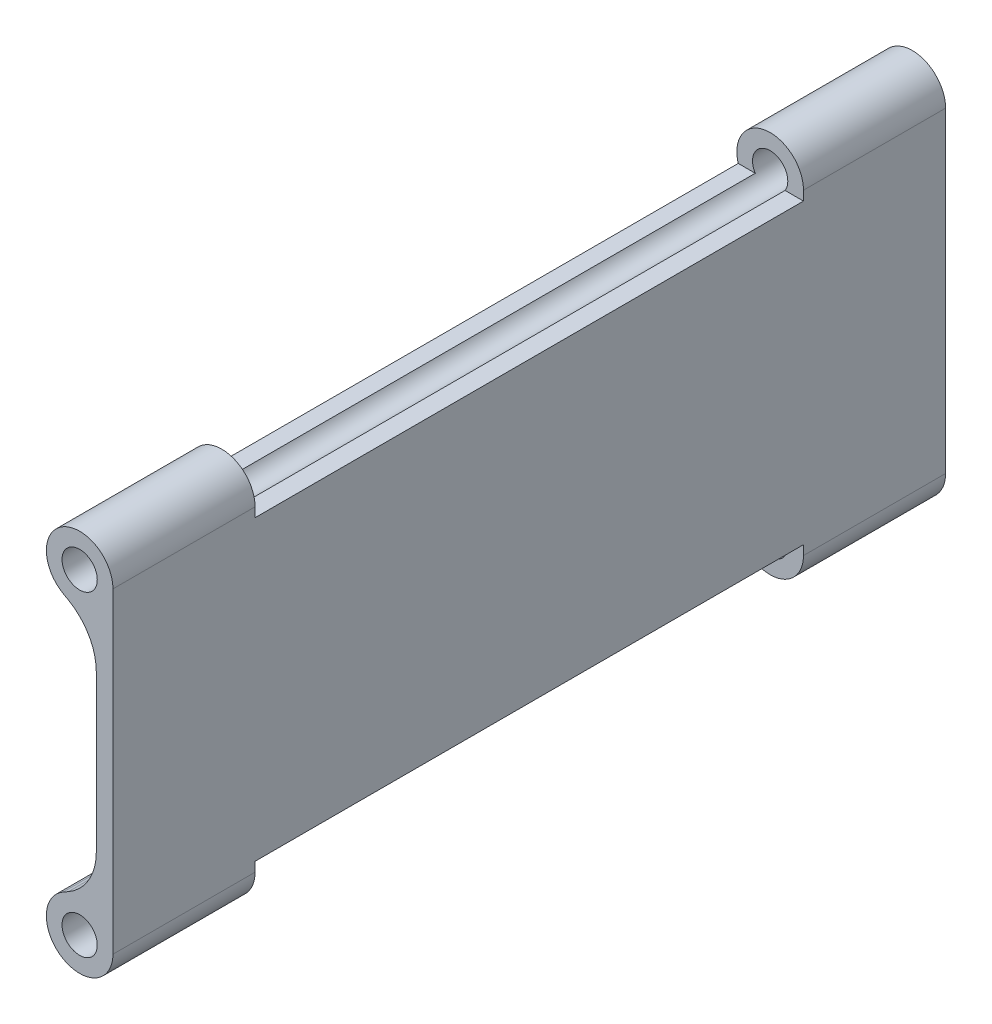
ISO-10303-21;
HEADER;
FILE_DESCRIPTION(('STEP AP214'),'2;1');
FILE_NAME('part.step','',(''),(''),'','','');
FILE_SCHEMA(('AUTOMOTIVE_DESIGN { 1 0 10303 214 1 1 1 1 }'));
ENDSEC;
DATA;
#1=APPLICATION_CONTEXT('core data for automotive mechanical design processes');
#2=APPLICATION_PROTOCOL_DEFINITION('international standard','automotive_design',2000,#1);
#3=PRODUCT_CONTEXT('',#1,'mechanical');
#4=PRODUCT('Part','Part','',(#3));
#5=PRODUCT_RELATED_PRODUCT_CATEGORY('part','',(#4));
#6=PRODUCT_DEFINITION_FORMATION('','',#4);
#7=PRODUCT_DEFINITION_CONTEXT('part definition',#1,'design');
#8=PRODUCT_DEFINITION('design','',#6,#7);
#9=PRODUCT_DEFINITION_SHAPE('','',#8);
#10=(LENGTH_UNIT() NAMED_UNIT(*) SI_UNIT(.MILLI.,.METRE.));
#11=(NAMED_UNIT(*) PLANE_ANGLE_UNIT() SI_UNIT($,.RADIAN.));
#12=(NAMED_UNIT(*) SI_UNIT($,.STERADIAN.) SOLID_ANGLE_UNIT());
#13=UNCERTAINTY_MEASURE_WITH_UNIT(LENGTH_MEASURE(1.E-05),#10,'distance_accuracy_value','');
#14=(GEOMETRIC_REPRESENTATION_CONTEXT(3) GLOBAL_UNCERTAINTY_ASSIGNED_CONTEXT((#13)) GLOBAL_UNIT_ASSIGNED_CONTEXT((#10,
#11,#12)) REPRESENTATION_CONTEXT('',''));
#15=CARTESIAN_POINT('',(0.,0.,0.));
#16=DIRECTION('',(0.,0.,1.));
#17=DIRECTION('',(1.,0.,0.));
#18=AXIS2_PLACEMENT_3D('',#15,#16,#17);
#19=CARTESIAN_POINT('',(-6.,28.5,-150.));
#20=DIRECTION('',(0.,0.,1.));
#21=DIRECTION('',(1.,0.,0.));
#22=AXIS2_PLACEMENT_3D('',#19,#20,#21);
#23=CYLINDRICAL_SURFACE('',#22,6.);
#24=CARTESIAN_POINT('',(-6.,28.5,-25.604093846782));
#25=DIRECTION('',(0.,0.,1.));
#26=DIRECTION('',(0.,-1.,0.));
#27=AXIS2_PLACEMENT_3D('',#24,#25,#26);
#28=CIRCLE('',#27,6.);
#29=CARTESIAN_POINT('',(-11.7548405846867,26.8024105782486,-25.604093846782));
#30=VERTEX_POINT('',#29);
#31=CARTESIAN_POINT('',(0.,28.5,-25.604093846782));
#32=VERTEX_POINT('',#31);
#33=EDGE_CURVE('E213',#30,#32,#28,.F.);
#34=ORIENTED_EDGE('',*,*,#33,.F.);
#35=DIRECTION('',(0.,0.,1.));
#36=VECTOR('',#35,1.);
#37=CARTESIAN_POINT('',(-11.7548405846867,26.8024105782486,-150.));
#38=LINE('',#37,#36);
#39=CARTESIAN_POINT('',(-11.7548405846867,26.8024105782486,-124.395906153218));
#40=VERTEX_POINT('',#39);
#41=EDGE_CURVE('E209',#40,#30,#38,.T.);
#42=ORIENTED_EDGE('',*,*,#41,.F.);
#43=CARTESIAN_POINT('',(-6.,28.5,-124.395906153218));
#44=DIRECTION('',(0.,0.,-1.));
#45=DIRECTION('',(-1.,0.,0.));
#46=AXIS2_PLACEMENT_3D('',#43,#44,#45);
#47=CIRCLE('',#46,6.);
#48=CARTESIAN_POINT('',(0.,28.5,-124.395906153218));
#49=VERTEX_POINT('',#48);
#50=EDGE_CURVE('E211',#49,#40,#47,.F.);
#51=ORIENTED_EDGE('',*,*,#50,.F.);
#52=DIRECTION('',(0.,0.,1.));
#53=VECTOR('',#52,1.);
#54=CARTESIAN_POINT('',(0.,28.5,-150.));
#55=LINE('',#54,#53);
#56=CARTESIAN_POINT('',(0.,28.5,-150.));
#57=VERTEX_POINT('',#56);
#58=EDGE_CURVE('E184',#57,#49,#55,.T.);
#59=ORIENTED_EDGE('',*,*,#58,.F.);
#60=CARTESIAN_POINT('',(-6.,28.5,-150.));
#61=DIRECTION('',(0.,0.,1.));
#62=DIRECTION('',(1.,0.,0.));
#63=AXIS2_PLACEMENT_3D('',#60,#61,#62);
#64=CIRCLE('',#63,6.);
#65=CARTESIAN_POINT('',(-8.98691390995377,23.2963142586697,-150.));
#66=VERTEX_POINT('',#65);
#67=EDGE_CURVE('E228',#57,#66,#64,.T.);
#68=ORIENTED_EDGE('',*,*,#67,.T.);
#69=DIRECTION('',(0.,0.,1.));
#70=VECTOR('',#69,1.);
#71=CARTESIAN_POINT('',(-8.98691390995377,23.2963142586697,-150.));
#72=LINE('',#71,#70);
#73=CARTESIAN_POINT('',(-8.98691390995377,23.2963142586697,0.));
#74=VERTEX_POINT('',#73);
#75=EDGE_CURVE('E245',#66,#74,#72,.T.);
#76=ORIENTED_EDGE('',*,*,#75,.T.);
#77=CARTESIAN_POINT('',(-6.,28.5,0.));
#78=DIRECTION('',(0.,0.,1.));
#79=DIRECTION('',(1.,0.,0.));
#80=AXIS2_PLACEMENT_3D('',#77,#78,#79);
#81=CIRCLE('',#80,6.);
#82=CARTESIAN_POINT('',(0.,28.5,0.));
#83=VERTEX_POINT('',#82);
#84=EDGE_CURVE('E225',#83,#74,#81,.T.);
#85=ORIENTED_EDGE('',*,*,#84,.F.);
#86=EDGE_CURVE('E263',#32,#83,#55,.T.);
#87=ORIENTED_EDGE('',*,*,#86,.F.);
#88=EDGE_LOOP('',(#34,#42,#51,#59,#68,#76,#85,#87));
#89=FACE_BOUND('',#88,.T.);
#90=ADVANCED_FACE('F37',(#89),#23,.T.);
#91=CARTESIAN_POINT('',(0.,28.5,-150.));
#92=DIRECTION('',(1.,0.,0.));
#93=DIRECTION('',(0.,0.,-1.));
#94=AXIS2_PLACEMENT_3D('',#91,#92,#93);
#95=PLANE('',#94);
#96=DIRECTION('',(0.,-1.,0.));
#97=VECTOR('',#96,1.);
#98=CARTESIAN_POINT('',(0.,44.9478454916756,-25.604093846782));
#99=LINE('',#98,#97);
#100=CARTESIAN_POINT('',(0.,26.8024105782486,-25.604093846782));
#101=VERTEX_POINT('',#100);
#102=EDGE_CURVE('E180',#32,#101,#99,.T.);
#103=ORIENTED_EDGE('',*,*,#102,.F.);
#104=ORIENTED_EDGE('',*,*,#86,.T.);
#105=DIRECTION('',(0.,1.,0.));
#106=VECTOR('',#105,1.);
#107=CARTESIAN_POINT('',(0.,28.5,0.));
#108=LINE('',#107,#106);
#109=CARTESIAN_POINT('',(0.,-28.5,0.));
#110=VERTEX_POINT('',#109);
#111=EDGE_CURVE('E232',#110,#83,#108,.T.);
#112=ORIENTED_EDGE('',*,*,#111,.F.);
#113=DIRECTION('',(0.,0.,1.));
#114=VECTOR('',#113,1.);
#115=CARTESIAN_POINT('',(0.,-28.5,-150.));
#116=LINE('',#115,#114);
#117=CARTESIAN_POINT('',(0.,-28.5,-25.604093846782));
#118=VERTEX_POINT('',#117);
#119=EDGE_CURVE('E266',#118,#110,#116,.T.);
#120=ORIENTED_EDGE('',*,*,#119,.F.);
#121=DIRECTION('',(0.,-1.,0.));
#122=VECTOR('',#121,1.);
#123=CARTESIAN_POINT('',(0.,-44.9478454916756,-25.604093846782));
#124=LINE('',#123,#122);
#125=CARTESIAN_POINT('',(0.,-26.8024105782486,-25.604093846782));
#126=VERTEX_POINT('',#125);
#127=EDGE_CURVE('E195',#126,#118,#124,.T.);
#128=ORIENTED_EDGE('',*,*,#127,.F.);
#129=DIRECTION('',(0.,0.,1.));
#130=VECTOR('',#129,1.);
#131=CARTESIAN_POINT('',(0.,-26.8024105782486,-25.604093846782));
#132=LINE('',#131,#130);
#133=CARTESIAN_POINT('',(0.,-26.8024105782486,-124.395906153218));
#134=VERTEX_POINT('',#133);
#135=EDGE_CURVE('E192',#134,#126,#132,.T.);
#136=ORIENTED_EDGE('',*,*,#135,.F.);
#137=DIRECTION('',(0.,1.,0.));
#138=VECTOR('',#137,1.);
#139=CARTESIAN_POINT('',(0.,-44.9478454916756,-124.395906153218));
#140=LINE('',#139,#138);
#141=CARTESIAN_POINT('',(0.,-28.5,-124.395906153218));
#142=VERTEX_POINT('',#141);
#143=EDGE_CURVE('E189',#142,#134,#140,.T.);
#144=ORIENTED_EDGE('',*,*,#143,.F.);
#145=CARTESIAN_POINT('',(0.,-28.5,-150.));
#146=VERTEX_POINT('',#145);
#147=EDGE_CURVE('E264',#146,#142,#116,.T.);
#148=ORIENTED_EDGE('',*,*,#147,.F.);
#149=DIRECTION('',(0.,1.,0.));
#150=VECTOR('',#149,1.);
#151=CARTESIAN_POINT('',(0.,28.5,-150.));
#152=LINE('',#151,#150);
#153=EDGE_CURVE('E243',#146,#57,#152,.T.);
#154=ORIENTED_EDGE('',*,*,#153,.T.);
#155=ORIENTED_EDGE('',*,*,#58,.T.);
#156=DIRECTION('',(0.,1.,0.));
#157=VECTOR('',#156,1.);
#158=CARTESIAN_POINT('',(0.,44.9478454916756,-124.395906153218));
#159=LINE('',#158,#157);
#160=CARTESIAN_POINT('',(0.,26.8024105782486,-124.395906153218));
#161=VERTEX_POINT('',#160);
#162=EDGE_CURVE('E167',#161,#49,#159,.T.);
#163=ORIENTED_EDGE('',*,*,#162,.F.);
#164=DIRECTION('',(0.,0.,-1.));
#165=VECTOR('',#164,1.);
#166=CARTESIAN_POINT('',(0.,26.8024105782486,-25.604093846782));
#167=LINE('',#166,#165);
#168=EDGE_CURVE('E176',#101,#161,#167,.T.);
#169=ORIENTED_EDGE('',*,*,#168,.F.);
#170=EDGE_LOOP('',(#103,#104,#112,#120,#128,#136,#144,#148,#154,#155,#163,#169));
#171=FACE_BOUND('',#170,.T.);
#172=ADVANCED_FACE('F182',(#171),#95,.T.);
#173=CARTESIAN_POINT('',(-6.,-28.5,-150.));
#174=DIRECTION('',(0.,0.,1.));
#175=DIRECTION('',(1.,0.,0.));
#176=AXIS2_PLACEMENT_3D('',#173,#174,#175);
#177=CYLINDRICAL_SURFACE('',#176,6.);
#178=CARTESIAN_POINT('',(-6.,-28.5,-124.395906153218));
#179=DIRECTION('',(0.,0.,-1.));
#180=DIRECTION('',(-1.,0.,0.));
#181=AXIS2_PLACEMENT_3D('',#178,#179,#180);
#182=CIRCLE('',#181,6.);
#183=CARTESIAN_POINT('',(-11.7548405846867,-26.8024105782486,-124.395906153218));
#184=VERTEX_POINT('',#183);
#185=EDGE_CURVE('E60',#184,#142,#182,.F.);
#186=ORIENTED_EDGE('',*,*,#185,.F.);
#187=DIRECTION('',(0.,0.,1.));
#188=VECTOR('',#187,1.);
#189=CARTESIAN_POINT('',(-11.7548405846867,-26.8024105782486,-150.));
#190=LINE('',#189,#188);
#191=CARTESIAN_POINT('',(-11.7548405846867,-26.8024105782486,-25.604093846782));
#192=VERTEX_POINT('',#191);
#193=EDGE_CURVE('E204',#192,#184,#190,.F.);
#194=ORIENTED_EDGE('',*,*,#193,.F.);
#195=CARTESIAN_POINT('',(-6.,-28.5,-25.604093846782));
#196=DIRECTION('',(0.,0.,1.));
#197=DIRECTION('',(1.,0.,0.));
#198=AXIS2_PLACEMENT_3D('',#195,#196,#197);
#199=CIRCLE('',#198,6.);
#200=EDGE_CURVE('E207',#118,#192,#199,.F.);
#201=ORIENTED_EDGE('',*,*,#200,.F.);
#202=ORIENTED_EDGE('',*,*,#119,.T.);
#203=CARTESIAN_POINT('',(-6.,-28.5,0.));
#204=DIRECTION('',(0.,0.,1.));
#205=DIRECTION('',(-1.,0.,0.));
#206=AXIS2_PLACEMENT_3D('',#203,#204,#205);
#207=CIRCLE('',#206,6.);
#208=CARTESIAN_POINT('',(-8.98691390995377,-23.2963142586697,0.));
#209=VERTEX_POINT('',#208);
#210=EDGE_CURVE('E256',#209,#110,#207,.T.);
#211=ORIENTED_EDGE('',*,*,#210,.F.);
#212=DIRECTION('',(0.,0.,1.));
#213=VECTOR('',#212,1.);
#214=CARTESIAN_POINT('',(-8.98691390995377,-23.2963142586697,-150.));
#215=LINE('',#214,#213);
#216=CARTESIAN_POINT('',(-8.98691390995377,-23.2963142586697,-150.));
#217=VERTEX_POINT('',#216);
#218=EDGE_CURVE('E267',#217,#209,#215,.T.);
#219=ORIENTED_EDGE('',*,*,#218,.F.);
#220=CARTESIAN_POINT('',(-6.,-28.5,-150.));
#221=DIRECTION('',(0.,0.,1.));
#222=DIRECTION('',(-1.,0.,0.));
#223=AXIS2_PLACEMENT_3D('',#220,#221,#222);
#224=CIRCLE('',#223,6.);
#225=EDGE_CURVE('E240',#217,#146,#224,.T.);
#226=ORIENTED_EDGE('',*,*,#225,.T.);
#227=ORIENTED_EDGE('',*,*,#147,.T.);
#228=EDGE_LOOP('',(#186,#194,#201,#202,#211,#219,#226,#227));
#229=FACE_BOUND('',#228,.T.);
#230=ADVANCED_FACE('F329',(#229),#177,.T.);
#231=CARTESIAN_POINT('',(-2.99999999999999,-19.8598276366384,-150.));
#232=DIRECTION('',(-0.497818984992297,0.867280956888389,0.));
#233=DIRECTION('',(-0.867280956888389,-0.497818984992297,0.));
#234=AXIS2_PLACEMENT_3D('',#231,#232,#233);
#235=PLANE('',#234);
#236=DIRECTION('',(-0.867280956888389,-0.497818984992297,0.));
#237=VECTOR('',#236,1.);
#238=CARTESIAN_POINT('',(-2.99999999999999,-19.8598276366384,0.));
#239=LINE('',#238,#237);
#240=CARTESIAN_POINT('',(-8.02181015007702,-22.7423450168246,0.));
#241=VERTEX_POINT('',#240);
#242=EDGE_CURVE('E254',#241,#209,#239,.T.);
#243=ORIENTED_EDGE('',*,*,#242,.F.);
#244=DIRECTION('',(0.,0.,1.));
#245=VECTOR('',#244,1.);
#246=CARTESIAN_POINT('',(-8.02181015007702,-22.7423450168246,-150.));
#247=LINE('',#246,#245);
#248=CARTESIAN_POINT('',(-8.02181015007702,-22.7423450168246,-150.));
#249=VERTEX_POINT('',#248);
#250=EDGE_CURVE('E275',#241,#249,#247,.F.);
#251=ORIENTED_EDGE('',*,*,#250,.T.);
#252=DIRECTION('',(-0.867280956888389,-0.497818984992297,0.));
#253=VECTOR('',#252,1.);
#254=CARTESIAN_POINT('',(-2.99999999999999,-19.8598276366384,-150.));
#255=LINE('',#254,#253);
#256=EDGE_CURVE('E238',#249,#217,#255,.T.);
#257=ORIENTED_EDGE('',*,*,#256,.T.);
#258=ORIENTED_EDGE('',*,*,#218,.T.);
#259=EDGE_LOOP('',(#243,#251,#257,#258));
#260=FACE_BOUND('',#259,.T.);
#261=ADVANCED_FACE('F418',(#260),#235,.T.);
#262=CARTESIAN_POINT('',(-2.99999999999999,19.8598276366384,-150.));
#263=DIRECTION('',(-1.,0.,0.));
#264=DIRECTION('',(0.,0.,1.));
#265=AXIS2_PLACEMENT_3D('',#262,#263,#264);
#266=PLANE('',#265);
#267=DIRECTION('',(0.,-1.,0.));
#268=VECTOR('',#267,1.);
#269=CARTESIAN_POINT('',(-2.99999999999999,19.8598276366384,-150.));
#270=LINE('',#269,#268);
#271=CARTESIAN_POINT('',(-2.99999999999999,14.0695354479408,-150.));
#272=VERTEX_POINT('',#271);
#273=CARTESIAN_POINT('',(-2.99999999999999,-14.0695354479408,-150.));
#274=VERTEX_POINT('',#273);
#275=EDGE_CURVE('E235',#272,#274,#270,.T.);
#276=ORIENTED_EDGE('',*,*,#275,.T.);
#277=DIRECTION('',(0.,0.,1.));
#278=VECTOR('',#277,1.);
#279=CARTESIAN_POINT('',(-2.99999999999999,-14.0695354479408,0.));
#280=LINE('',#279,#278);
#281=CARTESIAN_POINT('',(-2.99999999999999,-14.0695354479408,0.));
#282=VERTEX_POINT('',#281);
#283=EDGE_CURVE('E272',#274,#282,#280,.T.);
#284=ORIENTED_EDGE('',*,*,#283,.T.);
#285=DIRECTION('',(0.,-1.,0.));
#286=VECTOR('',#285,1.);
#287=CARTESIAN_POINT('',(-2.99999999999999,19.8598276366384,0.));
#288=LINE('',#287,#286);
#289=CARTESIAN_POINT('',(-2.99999999999999,14.0695354479408,0.));
#290=VERTEX_POINT('',#289);
#291=EDGE_CURVE('E251',#290,#282,#288,.T.);
#292=ORIENTED_EDGE('',*,*,#291,.F.);
#293=DIRECTION('',(0.,0.,1.));
#294=VECTOR('',#293,1.);
#295=CARTESIAN_POINT('',(-2.99999999999999,14.0695354479408,-150.));
#296=LINE('',#295,#294);
#297=EDGE_CURVE('E262',#290,#272,#296,.F.);
#298=ORIENTED_EDGE('',*,*,#297,.T.);
#299=EDGE_LOOP('',(#276,#284,#292,#298));
#300=FACE_BOUND('',#299,.T.);
#301=ADVANCED_FACE('F383',(#300),#266,.T.);
#302=CARTESIAN_POINT('',(-2.99999999999999,19.8598276366384,-150.));
#303=DIRECTION('',(-0.497818984992297,-0.867280956888389,0.));
#304=DIRECTION('',(0.867280956888389,-0.497818984992297,0.));
#305=AXIS2_PLACEMENT_3D('',#302,#303,#304);
#306=PLANE('',#305);
#307=DIRECTION('',(0.867280956888389,-0.497818984992297,0.));
#308=VECTOR('',#307,1.);
#309=CARTESIAN_POINT('',(-2.99999999999999,19.8598276366384,-150.));
#310=LINE('',#309,#308);
#311=CARTESIAN_POINT('',(-8.02181015007702,22.7423450168246,-150.));
#312=VERTEX_POINT('',#311);
#313=EDGE_CURVE('E231',#66,#312,#310,.T.);
#314=ORIENTED_EDGE('',*,*,#313,.T.);
#315=DIRECTION('',(0.,0.,1.));
#316=VECTOR('',#315,1.);
#317=CARTESIAN_POINT('',(-8.02181015007702,22.7423450168246,0.));
#318=LINE('',#317,#316);
#319=CARTESIAN_POINT('',(-8.02181015007702,22.7423450168246,0.));
#320=VERTEX_POINT('',#319);
#321=EDGE_CURVE('E277',#312,#320,#318,.T.);
#322=ORIENTED_EDGE('',*,*,#321,.T.);
#323=DIRECTION('',(0.867280956888389,-0.497818984992297,0.));
#324=VECTOR('',#323,1.);
#325=CARTESIAN_POINT('',(-2.99999999999999,19.8598276366384,0.));
#326=LINE('',#325,#324);
#327=EDGE_CURVE('E248',#74,#320,#326,.T.);
#328=ORIENTED_EDGE('',*,*,#327,.F.);
#329=ORIENTED_EDGE('',*,*,#75,.F.);
#330=EDGE_LOOP('',(#314,#322,#328,#329));
#331=FACE_BOUND('',#330,.T.);
#332=ADVANCED_FACE('F367',(#331),#306,.T.);
#333=CARTESIAN_POINT('',(-6.,28.5,-150.));
#334=DIRECTION('',(0.,0.,1.));
#335=DIRECTION('',(1.,0.,0.));
#336=AXIS2_PLACEMENT_3D('',#333,#334,#335);
#337=PLANE('',#336);
#338=CARTESIAN_POINT('',(-6.,-28.5,-150.));
#339=DIRECTION('',(0.,0.,1.));
#340=DIRECTION('',(-1.,0.,0.));
#341=AXIS2_PLACEMENT_3D('',#338,#339,#340);
#342=CIRCLE('',#341,3.175);
#343=CARTESIAN_POINT('',(-9.175,-28.5,-150.));
#344=VERTEX_POINT('',#343);
#345=EDGE_CURVE('E216',#344,#344,#342,.T.);
#346=ORIENTED_EDGE('',*,*,#345,.T.);
#347=EDGE_LOOP('',(#346));
#348=FACE_BOUND('',#347,.T.);
#349=CARTESIAN_POINT('',(-6.,28.5,-150.));
#350=DIRECTION('',(0.,0.,1.));
#351=DIRECTION('',(1.,0.,0.));
#352=AXIS2_PLACEMENT_3D('',#349,#350,#351);
#353=CIRCLE('',#352,3.175);
#354=CARTESIAN_POINT('',(-2.825,28.5,-150.));
#355=VERTEX_POINT('',#354);
#356=EDGE_CURVE('E222',#355,#355,#353,.T.);
#357=ORIENTED_EDGE('',*,*,#356,.T.);
#358=EDGE_LOOP('',(#357));
#359=FACE_BOUND('',#358,.T.);
#360=ORIENTED_EDGE('',*,*,#67,.F.);
#361=ORIENTED_EDGE('',*,*,#153,.F.);
#362=ORIENTED_EDGE('',*,*,#225,.F.);
#363=ORIENTED_EDGE('',*,*,#256,.F.);
#364=CARTESIAN_POINT('',(-13.,-14.0695354479408,-150.));
#365=DIRECTION('',(0.,0.,1.));
#366=DIRECTION('',(1.,0.,0.));
#367=AXIS2_PLACEMENT_3D('',#364,#365,#366);
#368=CIRCLE('',#367,10.);
#369=EDGE_CURVE('E282',#249,#274,#368,.T.);
#370=ORIENTED_EDGE('',*,*,#369,.T.);
#371=ORIENTED_EDGE('',*,*,#275,.F.);
#372=CARTESIAN_POINT('',(-13.,14.0695354479408,-150.));
#373=DIRECTION('',(0.,0.,1.));
#374=DIRECTION('',(1.,0.,0.));
#375=AXIS2_PLACEMENT_3D('',#372,#373,#374);
#376=CIRCLE('',#375,10.);
#377=EDGE_CURVE('E286',#272,#312,#376,.T.);
#378=ORIENTED_EDGE('',*,*,#377,.T.);
#379=ORIENTED_EDGE('',*,*,#313,.F.);
#380=EDGE_LOOP('',(#360,#361,#362,#363,#370,#371,#378,#379));
#381=FACE_BOUND('',#380,.T.);
#382=ADVANCED_FACE('F343',(#348,#359,#381),#337,.F.);
#383=CARTESIAN_POINT('',(-6.,28.5,0.));
#384=DIRECTION('',(0.,0.,1.));
#385=DIRECTION('',(1.,0.,0.));
#386=AXIS2_PLACEMENT_3D('',#383,#384,#385);
#387=PLANE('',#386);
#388=CARTESIAN_POINT('',(-6.,-28.5,0.));
#389=DIRECTION('',(0.,0.,1.));
#390=DIRECTION('',(-1.,0.,0.));
#391=AXIS2_PLACEMENT_3D('',#388,#389,#390);
#392=CIRCLE('',#391,3.175);
#393=CARTESIAN_POINT('',(-9.175,-28.5,0.));
#394=VERTEX_POINT('',#393);
#395=EDGE_CURVE('E215',#394,#394,#392,.T.);
#396=ORIENTED_EDGE('',*,*,#395,.F.);
#397=EDGE_LOOP('',(#396));
#398=FACE_BOUND('',#397,.T.);
#399=CARTESIAN_POINT('',(-6.,28.5,0.));
#400=DIRECTION('',(0.,0.,1.));
#401=DIRECTION('',(1.,0.,0.));
#402=AXIS2_PLACEMENT_3D('',#399,#400,#401);
#403=CIRCLE('',#402,3.175);
#404=CARTESIAN_POINT('',(-2.825,28.5,0.));
#405=VERTEX_POINT('',#404);
#406=EDGE_CURVE('E219',#405,#405,#403,.T.);
#407=ORIENTED_EDGE('',*,*,#406,.F.);
#408=EDGE_LOOP('',(#407));
#409=FACE_BOUND('',#408,.T.);
#410=ORIENTED_EDGE('',*,*,#84,.T.);
#411=ORIENTED_EDGE('',*,*,#327,.T.);
#412=CARTESIAN_POINT('',(-13.,14.0695354479408,0.));
#413=DIRECTION('',(0.,0.,1.));
#414=DIRECTION('',(1.,0.,0.));
#415=AXIS2_PLACEMENT_3D('',#412,#413,#414);
#416=CIRCLE('',#415,10.);
#417=EDGE_CURVE('E284',#320,#290,#416,.F.);
#418=ORIENTED_EDGE('',*,*,#417,.T.);
#419=ORIENTED_EDGE('',*,*,#291,.T.);
#420=CARTESIAN_POINT('',(-13.,-14.0695354479408,0.));
#421=DIRECTION('',(0.,0.,1.));
#422=DIRECTION('',(1.,0.,0.));
#423=AXIS2_PLACEMENT_3D('',#420,#421,#422);
#424=CIRCLE('',#423,10.);
#425=EDGE_CURVE('E280',#282,#241,#424,.F.);
#426=ORIENTED_EDGE('',*,*,#425,.T.);
#427=ORIENTED_EDGE('',*,*,#242,.T.);
#428=ORIENTED_EDGE('',*,*,#210,.T.);
#429=ORIENTED_EDGE('',*,*,#111,.T.);
#430=EDGE_LOOP('',(#410,#411,#418,#419,#426,#427,#428,#429));
#431=FACE_BOUND('',#430,.T.);
#432=ADVANCED_FACE('F334',(#398,#409,#431),#387,.T.);
#433=CARTESIAN_POINT('',(-6.,28.5,-150.));
#434=DIRECTION('',(0.,0.,1.));
#435=DIRECTION('',(1.,0.,0.));
#436=AXIS2_PLACEMENT_3D('',#433,#434,#435);
#437=CYLINDRICAL_SURFACE('',#436,3.175);
#438=CARTESIAN_POINT('',(-6.,28.5,-25.604093846782));
#439=DIRECTION('',(0.,0.,1.));
#440=DIRECTION('',(0.,-1.,0.));
#441=AXIS2_PLACEMENT_3D('',#438,#439,#440);
#442=CIRCLE('',#441,3.175);
#443=CARTESIAN_POINT('',(-8.68306078111506,26.8024105782486,-25.604093846782));
#444=VERTEX_POINT('',#443);
#445=CARTESIAN_POINT('',(-3.31693921888494,26.8024105782486,-25.604093846782));
#446=VERTEX_POINT('',#445);
#447=EDGE_CURVE('E45',#444,#446,#442,.F.);
#448=ORIENTED_EDGE('',*,*,#447,.T.);
#449=DIRECTION('',(0.,0.,1.));
#450=VECTOR('',#449,1.);
#451=CARTESIAN_POINT('',(-3.31693921888494,26.8024105782486,-150.));
#452=LINE('',#451,#450);
#453=CARTESIAN_POINT('',(-3.31693921888494,26.8024105782486,-124.395906153218));
#454=VERTEX_POINT('',#453);
#455=EDGE_CURVE('E11',#446,#454,#452,.F.);
#456=ORIENTED_EDGE('',*,*,#455,.T.);
#457=CARTESIAN_POINT('',(-6.,28.5,-124.395906153218));
#458=DIRECTION('',(0.,0.,-1.));
#459=DIRECTION('',(-1.,0.,0.));
#460=AXIS2_PLACEMENT_3D('',#457,#458,#459);
#461=CIRCLE('',#460,3.175);
#462=CARTESIAN_POINT('',(-8.68306078111506,26.8024105782486,-124.395906153218));
#463=VERTEX_POINT('',#462);
#464=EDGE_CURVE('E171',#454,#463,#461,.F.);
#465=ORIENTED_EDGE('',*,*,#464,.T.);
#466=DIRECTION('',(0.,0.,1.));
#467=VECTOR('',#466,1.);
#468=CARTESIAN_POINT('',(-8.68306078111506,26.8024105782486,-150.));
#469=LINE('',#468,#467);
#470=EDGE_CURVE('E300',#463,#444,#469,.T.);
#471=ORIENTED_EDGE('',*,*,#470,.T.);
#472=EDGE_LOOP('',(#448,#456,#465,#471));
#473=FACE_BOUND('',#472,.T.);
#474=ORIENTED_EDGE('',*,*,#356,.F.);
#475=EDGE_LOOP('',(#474));
#476=FACE_BOUND('',#475,.T.);
#477=ORIENTED_EDGE('',*,*,#406,.T.);
#478=EDGE_LOOP('',(#477));
#479=FACE_BOUND('',#478,.T.);
#480=ADVANCED_FACE('F306',(#473,#476,#479),#437,.F.);
#481=CARTESIAN_POINT('',(-6.,-28.5,-150.));
#482=DIRECTION('',(0.,0.,1.));
#483=DIRECTION('',(1.,0.,0.));
#484=AXIS2_PLACEMENT_3D('',#481,#482,#483);
#485=CYLINDRICAL_SURFACE('',#484,3.175);
#486=DIRECTION('',(0.,0.,1.));
#487=VECTOR('',#486,1.);
#488=CARTESIAN_POINT('',(-3.31693921888494,-26.8024105782486,-150.));
#489=LINE('',#488,#487);
#490=CARTESIAN_POINT('',(-3.31693921888494,-26.8024105782486,-124.395906153218));
#491=VERTEX_POINT('',#490);
#492=CARTESIAN_POINT('',(-3.31693921888494,-26.8024105782486,-25.604093846782));
#493=VERTEX_POINT('',#492);
#494=EDGE_CURVE('E291',#491,#493,#489,.T.);
#495=ORIENTED_EDGE('',*,*,#494,.T.);
#496=CARTESIAN_POINT('',(-6.,-28.5,-25.604093846782));
#497=DIRECTION('',(0.,0.,1.));
#498=DIRECTION('',(1.,0.,0.));
#499=AXIS2_PLACEMENT_3D('',#496,#497,#498);
#500=CIRCLE('',#499,3.175);
#501=CARTESIAN_POINT('',(-8.68306078111506,-26.8024105782486,-25.604093846782));
#502=VERTEX_POINT('',#501);
#503=EDGE_CURVE('E297',#493,#502,#500,.F.);
#504=ORIENTED_EDGE('',*,*,#503,.T.);
#505=DIRECTION('',(0.,0.,1.));
#506=VECTOR('',#505,1.);
#507=CARTESIAN_POINT('',(-8.68306078111506,-26.8024105782486,-150.));
#508=LINE('',#507,#506);
#509=CARTESIAN_POINT('',(-8.68306078111506,-26.8024105782486,-124.395906153218));
#510=VERTEX_POINT('',#509);
#511=EDGE_CURVE('E294',#502,#510,#508,.F.);
#512=ORIENTED_EDGE('',*,*,#511,.T.);
#513=CARTESIAN_POINT('',(-6.,-28.5,-124.395906153218));
#514=DIRECTION('',(0.,0.,-1.));
#515=DIRECTION('',(-1.,0.,0.));
#516=AXIS2_PLACEMENT_3D('',#513,#514,#515);
#517=CIRCLE('',#516,3.175);
#518=EDGE_CURVE('E288',#510,#491,#517,.F.);
#519=ORIENTED_EDGE('',*,*,#518,.T.);
#520=EDGE_LOOP('',(#495,#504,#512,#519));
#521=FACE_BOUND('',#520,.T.);
#522=ORIENTED_EDGE('',*,*,#345,.F.);
#523=EDGE_LOOP('',(#522));
#524=FACE_BOUND('',#523,.T.);
#525=ORIENTED_EDGE('',*,*,#395,.T.);
#526=EDGE_LOOP('',(#525));
#527=FACE_BOUND('',#526,.T.);
#528=ADVANCED_FACE('F321',(#521,#524,#527),#485,.F.);
#529=CARTESIAN_POINT('',(-13.,-14.0695354479408,-150.));
#530=DIRECTION('',(0.,0.,-1.));
#531=DIRECTION('',(-1.,0.,0.));
#532=AXIS2_PLACEMENT_3D('',#529,#530,#531);
#533=CYLINDRICAL_SURFACE('',#532,10.);
#534=ORIENTED_EDGE('',*,*,#369,.F.);
#535=ORIENTED_EDGE('',*,*,#250,.F.);
#536=ORIENTED_EDGE('',*,*,#425,.F.);
#537=ORIENTED_EDGE('',*,*,#283,.F.);
#538=EDGE_LOOP('',(#534,#535,#536,#537));
#539=FACE_BOUND('',#538,.T.);
#540=ADVANCED_FACE('F369',(#539),#533,.F.);
#541=CARTESIAN_POINT('',(-13.,14.0695354479408,-150.));
#542=DIRECTION('',(0.,0.,-1.));
#543=DIRECTION('',(-1.,0.,0.));
#544=AXIS2_PLACEMENT_3D('',#541,#542,#543);
#545=CYLINDRICAL_SURFACE('',#544,10.);
#546=ORIENTED_EDGE('',*,*,#377,.F.);
#547=ORIENTED_EDGE('',*,*,#297,.F.);
#548=ORIENTED_EDGE('',*,*,#417,.F.);
#549=ORIENTED_EDGE('',*,*,#321,.F.);
#550=EDGE_LOOP('',(#546,#547,#548,#549));
#551=FACE_BOUND('',#550,.T.);
#552=ADVANCED_FACE('F39',(#551),#545,.F.);
#553=CARTESIAN_POINT('',(-12.,-44.9478454916756,-25.604093846782));
#554=DIRECTION('',(0.,0.,1.));
#555=DIRECTION('',(1.,0.,0.));
#556=AXIS2_PLACEMENT_3D('',#553,#554,#555);
#557=PLANE('',#556);
#558=ORIENTED_EDGE('',*,*,#200,.T.);
#559=DIRECTION('',(1.,0.,0.));
#560=VECTOR('',#559,1.);
#561=CARTESIAN_POINT('',(-12.,-26.8024105782486,-25.604093846782));
#562=LINE('',#561,#560);
#563=EDGE_CURVE('E200',#192,#502,#562,.T.);
#564=ORIENTED_EDGE('',*,*,#563,.T.);
#565=ORIENTED_EDGE('',*,*,#503,.F.);
#566=EDGE_CURVE('E198',#493,#126,#562,.T.);
#567=ORIENTED_EDGE('',*,*,#566,.T.);
#568=ORIENTED_EDGE('',*,*,#127,.T.);
#569=EDGE_LOOP('',(#558,#564,#565,#567,#568));
#570=FACE_BOUND('',#569,.T.);
#571=ADVANCED_FACE('F316',(#570),#557,.F.);
#572=CARTESIAN_POINT('',(-12.,-26.8024105782486,-25.604093846782));
#573=DIRECTION('',(0.,1.,0.));
#574=DIRECTION('',(0.,0.,1.));
#575=AXIS2_PLACEMENT_3D('',#572,#573,#574);
#576=PLANE('',#575);
#577=ORIENTED_EDGE('',*,*,#193,.T.);
#578=DIRECTION('',(1.,0.,0.));
#579=VECTOR('',#578,1.);
#580=CARTESIAN_POINT('',(-12.,-26.8024105782486,-124.395906153218));
#581=LINE('',#580,#579);
#582=EDGE_CURVE('E201',#184,#510,#581,.T.);
#583=ORIENTED_EDGE('',*,*,#582,.T.);
#584=ORIENTED_EDGE('',*,*,#511,.F.);
#585=ORIENTED_EDGE('',*,*,#563,.F.);
#586=EDGE_LOOP('',(#577,#583,#584,#585));
#587=FACE_BOUND('',#586,.T.);
#588=ADVANCED_FACE('F350',(#587),#576,.F.);
#589=EDGE_CURVE('E197',#491,#134,#581,.T.);
#590=ORIENTED_EDGE('',*,*,#589,.T.);
#591=ORIENTED_EDGE('',*,*,#135,.T.);
#592=ORIENTED_EDGE('',*,*,#566,.F.);
#593=ORIENTED_EDGE('',*,*,#494,.F.);
#594=EDGE_LOOP('',(#590,#591,#592,#593));
#595=FACE_BOUND('',#594,.T.);
#596=ADVANCED_FACE('F325',(#595),#576,.F.);
#597=CARTESIAN_POINT('',(-12.,-44.9478454916756,-124.395906153218));
#598=DIRECTION('',(0.,0.,-1.));
#599=DIRECTION('',(-1.,0.,0.));
#600=AXIS2_PLACEMENT_3D('',#597,#598,#599);
#601=PLANE('',#600);
#602=ORIENTED_EDGE('',*,*,#185,.T.);
#603=ORIENTED_EDGE('',*,*,#143,.T.);
#604=ORIENTED_EDGE('',*,*,#589,.F.);
#605=ORIENTED_EDGE('',*,*,#518,.F.);
#606=ORIENTED_EDGE('',*,*,#582,.F.);
#607=EDGE_LOOP('',(#602,#603,#604,#605,#606));
#608=FACE_BOUND('',#607,.T.);
#609=ADVANCED_FACE('F348',(#608),#601,.F.);
#610=CARTESIAN_POINT('',(-12.,44.9478454916756,-25.604093846782));
#611=DIRECTION('',(0.,0.,1.));
#612=DIRECTION('',(0.,-1.,0.));
#613=AXIS2_PLACEMENT_3D('',#610,#611,#612);
#614=PLANE('',#613);
#615=ORIENTED_EDGE('',*,*,#33,.T.);
#616=ORIENTED_EDGE('',*,*,#102,.T.);
#617=DIRECTION('',(1.,0.,0.));
#618=VECTOR('',#617,1.);
#619=CARTESIAN_POINT('',(-12.,26.8024105782486,-25.604093846782));
#620=LINE('',#619,#618);
#621=EDGE_CURVE('E52',#446,#101,#620,.T.);
#622=ORIENTED_EDGE('',*,*,#621,.F.);
#623=ORIENTED_EDGE('',*,*,#447,.F.);
#624=EDGE_CURVE('E173',#30,#444,#620,.T.);
#625=ORIENTED_EDGE('',*,*,#624,.F.);
#626=EDGE_LOOP('',(#615,#616,#622,#623,#625));
#627=FACE_BOUND('',#626,.T.);
#628=ADVANCED_FACE('F310',(#627),#614,.F.);
#629=CARTESIAN_POINT('',(-12.,44.9478454916756,-124.395906153218));
#630=DIRECTION('',(0.,0.,-1.));
#631=DIRECTION('',(-1.,0.,0.));
#632=AXIS2_PLACEMENT_3D('',#629,#630,#631);
#633=PLANE('',#632);
#634=ORIENTED_EDGE('',*,*,#50,.T.);
#635=DIRECTION('',(1.,0.,0.));
#636=VECTOR('',#635,1.);
#637=CARTESIAN_POINT('',(-12.,26.8024105782486,-124.395906153218));
#638=LINE('',#637,#636);
#639=EDGE_CURVE('E172',#40,#463,#638,.T.);
#640=ORIENTED_EDGE('',*,*,#639,.T.);
#641=ORIENTED_EDGE('',*,*,#464,.F.);
#642=EDGE_CURVE('E164',#454,#161,#638,.T.);
#643=ORIENTED_EDGE('',*,*,#642,.T.);
#644=ORIENTED_EDGE('',*,*,#162,.T.);
#645=EDGE_LOOP('',(#634,#640,#641,#643,#644));
#646=FACE_BOUND('',#645,.T.);
#647=ADVANCED_FACE('F165',(#646),#633,.F.);
#648=CARTESIAN_POINT('',(-12.,26.8024105782486,-25.604093846782));
#649=DIRECTION('',(0.,-1.,0.));
#650=DIRECTION('',(0.,0.,-1.));
#651=AXIS2_PLACEMENT_3D('',#648,#649,#650);
#652=PLANE('',#651);
#653=ORIENTED_EDGE('',*,*,#621,.T.);
#654=ORIENTED_EDGE('',*,*,#168,.T.);
#655=ORIENTED_EDGE('',*,*,#642,.F.);
#656=ORIENTED_EDGE('',*,*,#455,.F.);
#657=EDGE_LOOP('',(#653,#654,#655,#656));
#658=FACE_BOUND('',#657,.T.);
#659=ADVANCED_FACE('F177',(#658),#652,.F.);
#660=ORIENTED_EDGE('',*,*,#41,.T.);
#661=ORIENTED_EDGE('',*,*,#624,.T.);
#662=ORIENTED_EDGE('',*,*,#470,.F.);
#663=ORIENTED_EDGE('',*,*,#639,.F.);
#664=EDGE_LOOP('',(#660,#661,#662,#663));
#665=FACE_BOUND('',#664,.T.);
#666=ADVANCED_FACE('F392',(#665),#652,.F.);
#667=CLOSED_SHELL('',(#90,#172,#230,#261,#301,#332,#382,#432,#480,#528,#540,#552,#571,#588,#596,
#609,#628,#647,#659,#666));
#668=MANIFOLD_SOLID_BREP('B2',#667);
#669=ADVANCED_BREP_SHAPE_REPRESENTATION('',(#18,#668),#14);
#670=SHAPE_DEFINITION_REPRESENTATION(#9,#669);
ENDSEC;
END-ISO-10303-21;
